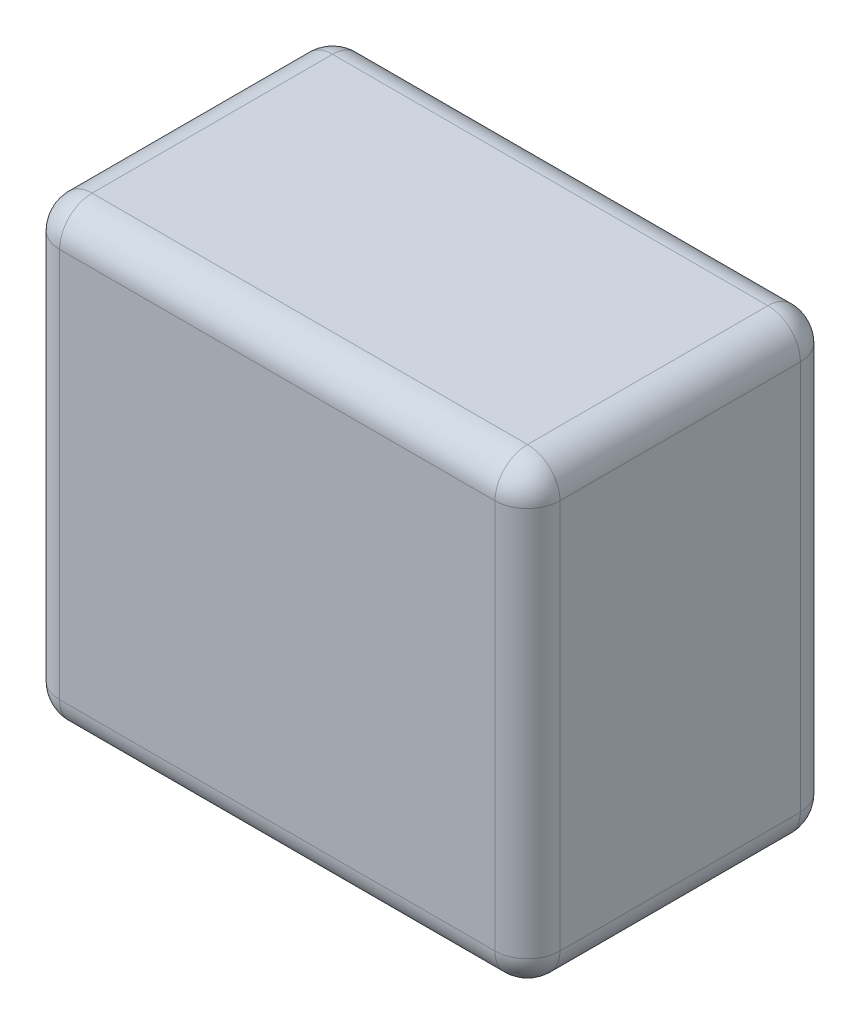
ISO-10303-21;
HEADER;
FILE_DESCRIPTION(('STEP AP214'),'2;1');
FILE_NAME('part.step','',(''),(''),'','','');
FILE_SCHEMA(('AUTOMOTIVE_DESIGN { 1 0 10303 214 1 1 1 1 }'));
ENDSEC;
DATA;
#1=APPLICATION_CONTEXT('core data for automotive mechanical design processes');
#2=APPLICATION_PROTOCOL_DEFINITION('international standard','automotive_design',2000,#1);
#3=PRODUCT_CONTEXT('',#1,'mechanical');
#4=PRODUCT('Part','Part','',(#3));
#5=PRODUCT_RELATED_PRODUCT_CATEGORY('part','',(#4));
#6=PRODUCT_DEFINITION_FORMATION('','',#4);
#7=PRODUCT_DEFINITION_CONTEXT('part definition',#1,'design');
#8=PRODUCT_DEFINITION('design','',#6,#7);
#9=PRODUCT_DEFINITION_SHAPE('','',#8);
#10=(LENGTH_UNIT() NAMED_UNIT(*) SI_UNIT(.MILLI.,.METRE.));
#11=(NAMED_UNIT(*) PLANE_ANGLE_UNIT() SI_UNIT($,.RADIAN.));
#12=(NAMED_UNIT(*) SI_UNIT($,.STERADIAN.) SOLID_ANGLE_UNIT());
#13=UNCERTAINTY_MEASURE_WITH_UNIT(LENGTH_MEASURE(1.E-05),#10,'distance_accuracy_value','');
#14=(GEOMETRIC_REPRESENTATION_CONTEXT(3) GLOBAL_UNCERTAINTY_ASSIGNED_CONTEXT((#13)) GLOBAL_UNIT_ASSIGNED_CONTEXT((#10,
#11,#12)) REPRESENTATION_CONTEXT('',''));
#15=CARTESIAN_POINT('',(0.,0.,0.));
#16=DIRECTION('',(0.,0.,1.));
#17=DIRECTION('',(1.,0.,0.));
#18=AXIS2_PLACEMENT_3D('',#15,#16,#17);
#19=CARTESIAN_POINT('',(0.,0.,47.));
#20=DIRECTION('',(1.,0.,0.));
#21=DIRECTION('',(0.,0.,-1.));
#22=AXIS2_PLACEMENT_3D('',#19,#20,#21);
#23=PLANE('',#22);
#24=DIRECTION('',(0.,0.,-1.));
#25=VECTOR('',#24,1.);
#26=CARTESIAN_POINT('',(0.,65.,47.));
#27=LINE('',#26,#25);
#28=CARTESIAN_POINT('',(0.,65.,42.));
#29=VERTEX_POINT('',#28);
#30=CARTESIAN_POINT('',(0.,65.,5.));
#31=VERTEX_POINT('',#30);
#32=EDGE_CURVE('E164',#29,#31,#27,.T.);
#33=ORIENTED_EDGE('',*,*,#32,.T.);
#34=DIRECTION('',(0.,-1.,0.));
#35=VECTOR('',#34,1.);
#36=CARTESIAN_POINT('',(0.,0.,5.));
#37=LINE('',#36,#35);
#38=CARTESIAN_POINT('',(0.,5.,5.));
#39=VERTEX_POINT('',#38);
#40=EDGE_CURVE('E134',#31,#39,#37,.T.);
#41=ORIENTED_EDGE('',*,*,#40,.T.);
#42=DIRECTION('',(0.,0.,-1.));
#43=VECTOR('',#42,1.);
#44=CARTESIAN_POINT('',(0.,5.,47.));
#45=LINE('',#44,#43);
#46=CARTESIAN_POINT('',(0.,5.,42.));
#47=VERTEX_POINT('',#46);
#48=EDGE_CURVE('E154',#39,#47,#45,.F.);
#49=ORIENTED_EDGE('',*,*,#48,.T.);
#50=DIRECTION('',(0.,-1.,0.));
#51=VECTOR('',#50,1.);
#52=CARTESIAN_POINT('',(0.,0.,42.));
#53=LINE('',#52,#51);
#54=EDGE_CURVE('E161',#47,#29,#53,.F.);
#55=ORIENTED_EDGE('',*,*,#54,.T.);
#56=EDGE_LOOP('',(#33,#41,#49,#55));
#57=FACE_BOUND('',#56,.T.);
#58=ADVANCED_FACE('F39',(#57),#23,.F.);
#59=CARTESIAN_POINT('',(0.,0.,47.));
#60=DIRECTION('',(0.,1.,0.));
#61=DIRECTION('',(0.,0.,1.));
#62=AXIS2_PLACEMENT_3D('',#59,#60,#61);
#63=PLANE('',#62);
#64=DIRECTION('',(1.,0.,0.));
#65=VECTOR('',#64,1.);
#66=CARTESIAN_POINT('',(0.,0.,42.));
#67=LINE('',#66,#65);
#68=CARTESIAN_POINT('',(72.,0.,42.));
#69=VERTEX_POINT('',#68);
#70=CARTESIAN_POINT('',(5.,0.,42.));
#71=VERTEX_POINT('',#70);
#72=EDGE_CURVE('E49',#69,#71,#67,.F.);
#73=ORIENTED_EDGE('',*,*,#72,.T.);
#74=DIRECTION('',(0.,0.,-1.));
#75=VECTOR('',#74,1.);
#76=CARTESIAN_POINT('',(5.,0.,47.));
#77=LINE('',#76,#75);
#78=CARTESIAN_POINT('',(5.,0.,5.));
#79=VERTEX_POINT('',#78);
#80=EDGE_CURVE('E11',#71,#79,#77,.T.);
#81=ORIENTED_EDGE('',*,*,#80,.T.);
#82=DIRECTION('',(1.,0.,0.));
#83=VECTOR('',#82,1.);
#84=CARTESIAN_POINT('',(77.,0.,5.));
#85=LINE('',#84,#83);
#86=CARTESIAN_POINT('',(72.,0.,5.));
#87=VERTEX_POINT('',#86);
#88=EDGE_CURVE('E222',#79,#87,#85,.T.);
#89=ORIENTED_EDGE('',*,*,#88,.T.);
#90=DIRECTION('',(0.,0.,-1.));
#91=VECTOR('',#90,1.);
#92=CARTESIAN_POINT('',(72.,0.,47.));
#93=LINE('',#92,#91);
#94=EDGE_CURVE('E60',#87,#69,#93,.F.);
#95=ORIENTED_EDGE('',*,*,#94,.T.);
#96=EDGE_LOOP('',(#73,#81,#89,#95));
#97=FACE_BOUND('',#96,.T.);
#98=ADVANCED_FACE('F384',(#97),#63,.F.);
#99=CARTESIAN_POINT('',(77.,0.,47.));
#100=DIRECTION('',(-1.,0.,0.));
#101=DIRECTION('',(0.,0.,1.));
#102=AXIS2_PLACEMENT_3D('',#99,#100,#101);
#103=PLANE('',#102);
#104=DIRECTION('',(0.,0.,-1.));
#105=VECTOR('',#104,1.);
#106=CARTESIAN_POINT('',(77.,65.,47.));
#107=LINE('',#106,#105);
#108=CARTESIAN_POINT('',(77.,65.,5.));
#109=VERTEX_POINT('',#108);
#110=CARTESIAN_POINT('',(77.,65.,42.));
#111=VERTEX_POINT('',#110);
#112=EDGE_CURVE('E215',#109,#111,#107,.F.);
#113=ORIENTED_EDGE('',*,*,#112,.T.);
#114=DIRECTION('',(0.,1.,0.));
#115=VECTOR('',#114,1.);
#116=CARTESIAN_POINT('',(77.,0.,42.));
#117=LINE('',#116,#115);
#118=CARTESIAN_POINT('',(77.,5.,42.));
#119=VERTEX_POINT('',#118);
#120=EDGE_CURVE('E218',#111,#119,#117,.F.);
#121=ORIENTED_EDGE('',*,*,#120,.T.);
#122=DIRECTION('',(0.,0.,-1.));
#123=VECTOR('',#122,1.);
#124=CARTESIAN_POINT('',(77.,5.,47.));
#125=LINE('',#124,#123);
#126=CARTESIAN_POINT('',(77.,5.,5.));
#127=VERTEX_POINT('',#126);
#128=EDGE_CURVE('E209',#119,#127,#125,.T.);
#129=ORIENTED_EDGE('',*,*,#128,.T.);
#130=DIRECTION('',(0.,1.,0.));
#131=VECTOR('',#130,1.);
#132=CARTESIAN_POINT('',(77.,70.,5.));
#133=LINE('',#132,#131);
#134=EDGE_CURVE('E212',#127,#109,#133,.T.);
#135=ORIENTED_EDGE('',*,*,#134,.T.);
#136=EDGE_LOOP('',(#113,#121,#129,#135));
#137=FACE_BOUND('',#136,.T.);
#138=ADVANCED_FACE('F336',(#137),#103,.F.);
#139=CARTESIAN_POINT('',(0.,70.,47.));
#140=DIRECTION('',(0.,-1.,0.));
#141=DIRECTION('',(0.,0.,-1.));
#142=AXIS2_PLACEMENT_3D('',#139,#140,#141);
#143=PLANE('',#142);
#144=DIRECTION('',(-1.,0.,0.));
#145=VECTOR('',#144,1.);
#146=CARTESIAN_POINT('',(0.,70.,5.));
#147=LINE('',#146,#145);
#148=CARTESIAN_POINT('',(72.,70.,5.));
#149=VERTEX_POINT('',#148);
#150=CARTESIAN_POINT('',(5.,70.,5.));
#151=VERTEX_POINT('',#150);
#152=EDGE_CURVE('E189',#149,#151,#147,.T.);
#153=ORIENTED_EDGE('',*,*,#152,.T.);
#154=DIRECTION('',(0.,0.,-1.));
#155=VECTOR('',#154,1.);
#156=CARTESIAN_POINT('',(5.,70.,47.));
#157=LINE('',#156,#155);
#158=CARTESIAN_POINT('',(5.,70.,42.));
#159=VERTEX_POINT('',#158);
#160=EDGE_CURVE('E192',#151,#159,#157,.F.);
#161=ORIENTED_EDGE('',*,*,#160,.T.);
#162=DIRECTION('',(-1.,0.,0.));
#163=VECTOR('',#162,1.);
#164=CARTESIAN_POINT('',(0.,70.,42.));
#165=LINE('',#164,#163);
#166=CARTESIAN_POINT('',(72.,70.,42.));
#167=VERTEX_POINT('',#166);
#168=EDGE_CURVE('E186',#159,#167,#165,.F.);
#169=ORIENTED_EDGE('',*,*,#168,.T.);
#170=DIRECTION('',(0.,0.,-1.));
#171=VECTOR('',#170,1.);
#172=CARTESIAN_POINT('',(72.,70.,47.));
#173=LINE('',#172,#171);
#174=EDGE_CURVE('E183',#167,#149,#173,.T.);
#175=ORIENTED_EDGE('',*,*,#174,.T.);
#176=EDGE_LOOP('',(#153,#161,#169,#175));
#177=FACE_BOUND('',#176,.T.);
#178=ADVANCED_FACE('F324',(#177),#143,.F.);
#179=CARTESIAN_POINT('',(0.,0.,47.));
#180=DIRECTION('',(0.,0.,-1.));
#181=DIRECTION('',(-1.,0.,0.));
#182=AXIS2_PLACEMENT_3D('',#179,#180,#181);
#183=PLANE('',#182);
#184=DIRECTION('',(0.,1.,0.));
#185=VECTOR('',#184,1.);
#186=CARTESIAN_POINT('',(72.,0.,47.));
#187=LINE('',#186,#185);
#188=CARTESIAN_POINT('',(72.,5.,47.));
#189=VERTEX_POINT('',#188);
#190=CARTESIAN_POINT('',(72.,65.,47.));
#191=VERTEX_POINT('',#190);
#192=EDGE_CURVE('E199',#189,#191,#187,.T.);
#193=ORIENTED_EDGE('',*,*,#192,.T.);
#194=DIRECTION('',(-1.,0.,0.));
#195=VECTOR('',#194,1.);
#196=CARTESIAN_POINT('',(0.,65.,47.));
#197=LINE('',#196,#195);
#198=CARTESIAN_POINT('',(5.,65.,47.));
#199=VERTEX_POINT('',#198);
#200=EDGE_CURVE('E205',#191,#199,#197,.T.);
#201=ORIENTED_EDGE('',*,*,#200,.T.);
#202=DIRECTION('',(0.,-1.,0.));
#203=VECTOR('',#202,1.);
#204=CARTESIAN_POINT('',(5.,0.,47.));
#205=LINE('',#204,#203);
#206=CARTESIAN_POINT('',(5.,5.,47.));
#207=VERTEX_POINT('',#206);
#208=EDGE_CURVE('E202',#199,#207,#205,.T.);
#209=ORIENTED_EDGE('',*,*,#208,.T.);
#210=DIRECTION('',(1.,0.,0.));
#211=VECTOR('',#210,1.);
#212=CARTESIAN_POINT('',(0.,5.,47.));
#213=LINE('',#212,#211);
#214=EDGE_CURVE('E196',#207,#189,#213,.T.);
#215=ORIENTED_EDGE('',*,*,#214,.T.);
#216=EDGE_LOOP('',(#193,#201,#209,#215));
#217=FACE_BOUND('',#216,.T.);
#218=ADVANCED_FACE('F333',(#217),#183,.F.);
#219=CARTESIAN_POINT('',(0.,0.,0.));
#220=DIRECTION('',(0.,0.,-1.));
#221=DIRECTION('',(-1.,0.,0.));
#222=AXIS2_PLACEMENT_3D('',#219,#220,#221);
#223=PLANE('',#222);
#224=DIRECTION('',(1.,0.,0.));
#225=VECTOR('',#224,1.);
#226=CARTESIAN_POINT('',(0.,5.,0.));
#227=LINE('',#226,#225);
#228=CARTESIAN_POINT('',(72.,5.,0.));
#229=VERTEX_POINT('',#228);
#230=CARTESIAN_POINT('',(5.,5.,0.));
#231=VERTEX_POINT('',#230);
#232=EDGE_CURVE('E167',#229,#231,#227,.F.);
#233=ORIENTED_EDGE('',*,*,#232,.T.);
#234=DIRECTION('',(0.,-1.,0.));
#235=VECTOR('',#234,1.);
#236=CARTESIAN_POINT('',(5.,70.,0.));
#237=LINE('',#236,#235);
#238=CARTESIAN_POINT('',(5.,65.,0.));
#239=VERTEX_POINT('',#238);
#240=EDGE_CURVE('E136',#231,#239,#237,.F.);
#241=ORIENTED_EDGE('',*,*,#240,.T.);
#242=DIRECTION('',(-1.,0.,0.));
#243=VECTOR('',#242,1.);
#244=CARTESIAN_POINT('',(77.,65.,0.));
#245=LINE('',#244,#243);
#246=CARTESIAN_POINT('',(72.,65.,0.));
#247=VERTEX_POINT('',#246);
#248=EDGE_CURVE('E178',#239,#247,#245,.F.);
#249=ORIENTED_EDGE('',*,*,#248,.T.);
#250=DIRECTION('',(0.,1.,0.));
#251=VECTOR('',#250,1.);
#252=CARTESIAN_POINT('',(72.,0.,0.));
#253=LINE('',#252,#251);
#254=EDGE_CURVE('E171',#247,#229,#253,.F.);
#255=ORIENTED_EDGE('',*,*,#254,.T.);
#256=EDGE_LOOP('',(#233,#241,#249,#255));
#257=FACE_BOUND('',#256,.T.);
#258=ADVANCED_FACE('F352',(#257),#223,.T.);
#259=CARTESIAN_POINT('',(72.,0.,42.));
#260=DIRECTION('',(0.,1.,0.));
#261=DIRECTION('',(0.,0.,1.));
#262=AXIS2_PLACEMENT_3D('',#259,#260,#261);
#263=CYLINDRICAL_SURFACE('',#262,5.);
#264=CARTESIAN_POINT('',(72.,65.,42.));
#265=DIRECTION('',(0.,1.,0.));
#266=DIRECTION('',(0.,0.,1.));
#267=AXIS2_PLACEMENT_3D('',#264,#265,#266);
#268=CIRCLE('',#267,5.);
#269=EDGE_CURVE('E43',#191,#111,#268,.T.);
#270=ORIENTED_EDGE('',*,*,#269,.F.);
#271=ORIENTED_EDGE('',*,*,#192,.F.);
#272=CARTESIAN_POINT('',(72.,5.,42.));
#273=DIRECTION('',(0.,-1.,0.));
#274=DIRECTION('',(0.,0.,-1.));
#275=AXIS2_PLACEMENT_3D('',#272,#273,#274);
#276=CIRCLE('',#275,5.);
#277=EDGE_CURVE('E298',#119,#189,#276,.T.);
#278=ORIENTED_EDGE('',*,*,#277,.F.);
#279=ORIENTED_EDGE('',*,*,#120,.F.);
#280=EDGE_LOOP('',(#270,#271,#278,#279));
#281=FACE_BOUND('',#280,.T.);
#282=ADVANCED_FACE('F41',(#281),#263,.T.);
#283=CARTESIAN_POINT('',(72.,65.,42.));
#284=DIRECTION('',(0.,0.,1.));
#285=DIRECTION('',(1.,0.,0.));
#286=AXIS2_PLACEMENT_3D('',#283,#284,#285);
#287=SPHERICAL_SURFACE('',#286,5.);
#288=CARTESIAN_POINT('',(72.,65.,42.));
#289=DIRECTION('',(1.,0.,0.));
#290=DIRECTION('',(0.,0.,-1.));
#291=AXIS2_PLACEMENT_3D('',#288,#289,#290);
#292=CIRCLE('',#291,5.);
#293=EDGE_CURVE('E291',#191,#167,#292,.F.);
#294=ORIENTED_EDGE('',*,*,#293,.F.);
#295=ORIENTED_EDGE('',*,*,#269,.T.);
#296=CARTESIAN_POINT('',(72.,65.,42.));
#297=DIRECTION('',(0.,0.,1.));
#298=DIRECTION('',(1.,0.,0.));
#299=AXIS2_PLACEMENT_3D('',#296,#297,#298);
#300=CIRCLE('',#299,5.);
#301=EDGE_CURVE('E295',#167,#111,#300,.F.);
#302=ORIENTED_EDGE('',*,*,#301,.F.);
#303=EDGE_LOOP('',(#294,#295,#302));
#304=FACE_BOUND('',#303,.T.);
#305=ADVANCED_FACE('F311',(#304),#287,.T.);
#306=CARTESIAN_POINT('',(72.,5.,42.));
#307=DIRECTION('',(0.,0.,1.));
#308=DIRECTION('',(1.,0.,0.));
#309=AXIS2_PLACEMENT_3D('',#306,#307,#308);
#310=SPHERICAL_SURFACE('',#309,5.);
#311=CARTESIAN_POINT('',(72.,5.,42.));
#312=DIRECTION('',(0.,0.,1.));
#313=DIRECTION('',(1.,0.,0.));
#314=AXIS2_PLACEMENT_3D('',#311,#312,#313);
#315=CIRCLE('',#314,5.);
#316=EDGE_CURVE('E284',#119,#69,#315,.F.);
#317=ORIENTED_EDGE('',*,*,#316,.F.);
#318=ORIENTED_EDGE('',*,*,#277,.T.);
#319=CARTESIAN_POINT('',(72.,5.,42.));
#320=DIRECTION('',(1.,0.,0.));
#321=DIRECTION('',(0.,0.,-1.));
#322=AXIS2_PLACEMENT_3D('',#319,#320,#321);
#323=CIRCLE('',#322,5.);
#324=EDGE_CURVE('E287',#69,#189,#323,.F.);
#325=ORIENTED_EDGE('',*,*,#324,.F.);
#326=EDGE_LOOP('',(#317,#318,#325));
#327=FACE_BOUND('',#326,.T.);
#328=ADVANCED_FACE('F375',(#327),#310,.T.);
#329=CARTESIAN_POINT('',(72.,65.,47.));
#330=DIRECTION('',(0.,0.,-1.));
#331=DIRECTION('',(-1.,0.,0.));
#332=AXIS2_PLACEMENT_3D('',#329,#330,#331);
#333=CYLINDRICAL_SURFACE('',#332,5.);
#334=ORIENTED_EDGE('',*,*,#301,.T.);
#335=ORIENTED_EDGE('',*,*,#112,.F.);
#336=CARTESIAN_POINT('',(72.,65.,5.));
#337=DIRECTION('',(0.,0.,-1.));
#338=DIRECTION('',(-1.,0.,0.));
#339=AXIS2_PLACEMENT_3D('',#336,#337,#338);
#340=CIRCLE('',#339,5.);
#341=EDGE_CURVE('E276',#149,#109,#340,.T.);
#342=ORIENTED_EDGE('',*,*,#341,.F.);
#343=ORIENTED_EDGE('',*,*,#174,.F.);
#344=EDGE_LOOP('',(#334,#335,#342,#343));
#345=FACE_BOUND('',#344,.T.);
#346=ADVANCED_FACE('F319',(#345),#333,.T.);
#347=CARTESIAN_POINT('',(0.,65.,42.));
#348=DIRECTION('',(-1.,0.,0.));
#349=DIRECTION('',(0.,0.,1.));
#350=AXIS2_PLACEMENT_3D('',#347,#348,#349);
#351=CYLINDRICAL_SURFACE('',#350,5.);
#352=ORIENTED_EDGE('',*,*,#293,.T.);
#353=ORIENTED_EDGE('',*,*,#168,.F.);
#354=CARTESIAN_POINT('',(5.,65.,42.));
#355=DIRECTION('',(-1.,0.,0.));
#356=DIRECTION('',(0.,0.,1.));
#357=AXIS2_PLACEMENT_3D('',#354,#355,#356);
#358=CIRCLE('',#357,5.);
#359=EDGE_CURVE('E272',#199,#159,#358,.T.);
#360=ORIENTED_EDGE('',*,*,#359,.F.);
#361=ORIENTED_EDGE('',*,*,#200,.F.);
#362=EDGE_LOOP('',(#352,#353,#360,#361));
#363=FACE_BOUND('',#362,.T.);
#364=ADVANCED_FACE('F330',(#363),#351,.T.);
#365=CARTESIAN_POINT('',(5.,0.,42.));
#366=DIRECTION('',(0.,-1.,0.));
#367=DIRECTION('',(0.,0.,-1.));
#368=AXIS2_PLACEMENT_3D('',#365,#366,#367);
#369=CYLINDRICAL_SURFACE('',#368,5.);
#370=CARTESIAN_POINT('',(5.,5.,42.));
#371=DIRECTION('',(0.,-1.,0.));
#372=DIRECTION('',(0.,0.,-1.));
#373=AXIS2_PLACEMENT_3D('',#370,#371,#372);
#374=CIRCLE('',#373,5.);
#375=EDGE_CURVE('E265',#207,#47,#374,.T.);
#376=ORIENTED_EDGE('',*,*,#375,.F.);
#377=ORIENTED_EDGE('',*,*,#208,.F.);
#378=CARTESIAN_POINT('',(5.,65.,42.));
#379=DIRECTION('',(0.,1.,0.));
#380=DIRECTION('',(0.,0.,1.));
#381=AXIS2_PLACEMENT_3D('',#378,#379,#380);
#382=CIRCLE('',#381,5.);
#383=EDGE_CURVE('E269',#29,#199,#382,.T.);
#384=ORIENTED_EDGE('',*,*,#383,.F.);
#385=ORIENTED_EDGE('',*,*,#54,.F.);
#386=EDGE_LOOP('',(#376,#377,#384,#385));
#387=FACE_BOUND('',#386,.T.);
#388=ADVANCED_FACE('F370',(#387),#369,.T.);
#389=CARTESIAN_POINT('',(0.,5.,42.));
#390=DIRECTION('',(1.,0.,0.));
#391=DIRECTION('',(0.,0.,-1.));
#392=AXIS2_PLACEMENT_3D('',#389,#390,#391);
#393=CYLINDRICAL_SURFACE('',#392,5.);
#394=ORIENTED_EDGE('',*,*,#324,.T.);
#395=ORIENTED_EDGE('',*,*,#214,.F.);
#396=CARTESIAN_POINT('',(5.,5.,42.));
#397=DIRECTION('',(-1.,0.,0.));
#398=DIRECTION('',(0.,0.,1.));
#399=AXIS2_PLACEMENT_3D('',#396,#397,#398);
#400=CIRCLE('',#399,5.);
#401=EDGE_CURVE('E261',#71,#207,#400,.T.);
#402=ORIENTED_EDGE('',*,*,#401,.F.);
#403=ORIENTED_EDGE('',*,*,#72,.F.);
#404=EDGE_LOOP('',(#394,#395,#402,#403));
#405=FACE_BOUND('',#404,.T.);
#406=ADVANCED_FACE('F374',(#405),#393,.T.);
#407=CARTESIAN_POINT('',(72.,5.,47.));
#408=DIRECTION('',(0.,0.,-1.));
#409=DIRECTION('',(-1.,0.,0.));
#410=AXIS2_PLACEMENT_3D('',#407,#408,#409);
#411=CYLINDRICAL_SURFACE('',#410,5.);
#412=ORIENTED_EDGE('',*,*,#316,.T.);
#413=ORIENTED_EDGE('',*,*,#94,.F.);
#414=CARTESIAN_POINT('',(72.,5.,5.));
#415=DIRECTION('',(0.,0.,-1.));
#416=DIRECTION('',(-1.,0.,0.));
#417=AXIS2_PLACEMENT_3D('',#414,#415,#416);
#418=CIRCLE('',#417,5.);
#419=EDGE_CURVE('E257',#127,#87,#418,.T.);
#420=ORIENTED_EDGE('',*,*,#419,.F.);
#421=ORIENTED_EDGE('',*,*,#128,.F.);
#422=EDGE_LOOP('',(#412,#413,#420,#421));
#423=FACE_BOUND('',#422,.T.);
#424=ADVANCED_FACE('F345',(#423),#411,.T.);
#425=CARTESIAN_POINT('',(72.,0.,5.));
#426=DIRECTION('',(0.,-1.,0.));
#427=DIRECTION('',(0.,0.,-1.));
#428=AXIS2_PLACEMENT_3D('',#425,#426,#427);
#429=CYLINDRICAL_SURFACE('',#428,5.);
#430=CARTESIAN_POINT('',(72.,65.,5.));
#431=DIRECTION('',(0.,1.,0.));
#432=DIRECTION('',(0.,0.,1.));
#433=AXIS2_PLACEMENT_3D('',#430,#431,#432);
#434=CIRCLE('',#433,5.);
#435=EDGE_CURVE('E280',#109,#247,#434,.T.);
#436=ORIENTED_EDGE('',*,*,#435,.F.);
#437=ORIENTED_EDGE('',*,*,#134,.F.);
#438=CARTESIAN_POINT('',(72.,5.,5.));
#439=DIRECTION('',(0.,-1.,0.));
#440=DIRECTION('',(0.,0.,-1.));
#441=AXIS2_PLACEMENT_3D('',#438,#439,#440);
#442=CIRCLE('',#441,5.);
#443=EDGE_CURVE('E253',#229,#127,#442,.T.);
#444=ORIENTED_EDGE('',*,*,#443,.F.);
#445=ORIENTED_EDGE('',*,*,#254,.F.);
#446=EDGE_LOOP('',(#436,#437,#444,#445));
#447=FACE_BOUND('',#446,.T.);
#448=ADVANCED_FACE('F341',(#447),#429,.T.);
#449=CARTESIAN_POINT('',(72.,65.,5.));
#450=DIRECTION('',(0.,0.,1.));
#451=DIRECTION('',(1.,0.,0.));
#452=AXIS2_PLACEMENT_3D('',#449,#450,#451);
#453=SPHERICAL_SURFACE('',#452,5.);
#454=ORIENTED_EDGE('',*,*,#341,.T.);
#455=ORIENTED_EDGE('',*,*,#435,.T.);
#456=CARTESIAN_POINT('',(72.,65.,5.));
#457=DIRECTION('',(1.,0.,0.));
#458=DIRECTION('',(0.,0.,-1.));
#459=AXIS2_PLACEMENT_3D('',#456,#457,#458);
#460=CIRCLE('',#459,5.);
#461=EDGE_CURVE('E249',#149,#247,#460,.F.);
#462=ORIENTED_EDGE('',*,*,#461,.F.);
#463=EDGE_LOOP('',(#454,#455,#462));
#464=FACE_BOUND('',#463,.T.);
#465=ADVANCED_FACE('F355',(#464),#453,.T.);
#466=CARTESIAN_POINT('',(5.,65.,42.));
#467=DIRECTION('',(0.,0.,1.));
#468=DIRECTION('',(1.,0.,0.));
#469=AXIS2_PLACEMENT_3D('',#466,#467,#468);
#470=SPHERICAL_SURFACE('',#469,5.);
#471=ORIENTED_EDGE('',*,*,#383,.T.);
#472=ORIENTED_EDGE('',*,*,#359,.T.);
#473=CARTESIAN_POINT('',(5.,65.,42.));
#474=DIRECTION('',(0.,0.,1.));
#475=DIRECTION('',(1.,0.,0.));
#476=AXIS2_PLACEMENT_3D('',#473,#474,#475);
#477=CIRCLE('',#476,5.);
#478=EDGE_CURVE('E246',#29,#159,#477,.F.);
#479=ORIENTED_EDGE('',*,*,#478,.F.);
#480=EDGE_LOOP('',(#471,#472,#479));
#481=FACE_BOUND('',#480,.T.);
#482=ADVANCED_FACE('F366',(#481),#470,.T.);
#483=CARTESIAN_POINT('',(5.,5.,42.));
#484=DIRECTION('',(0.,0.,1.));
#485=DIRECTION('',(1.,0.,0.));
#486=AXIS2_PLACEMENT_3D('',#483,#484,#485);
#487=SPHERICAL_SURFACE('',#486,5.);
#488=ORIENTED_EDGE('',*,*,#401,.T.);
#489=ORIENTED_EDGE('',*,*,#375,.T.);
#490=CARTESIAN_POINT('',(5.,5.,42.));
#491=DIRECTION('',(0.,0.,1.));
#492=DIRECTION('',(1.,0.,0.));
#493=AXIS2_PLACEMENT_3D('',#490,#491,#492);
#494=CIRCLE('',#493,5.);
#495=EDGE_CURVE('E157',#71,#47,#494,.F.);
#496=ORIENTED_EDGE('',*,*,#495,.F.);
#497=EDGE_LOOP('',(#488,#489,#496));
#498=FACE_BOUND('',#497,.T.);
#499=ADVANCED_FACE('F372',(#498),#487,.T.);
#500=CARTESIAN_POINT('',(72.,5.,5.));
#501=DIRECTION('',(0.,0.,1.));
#502=DIRECTION('',(1.,0.,0.));
#503=AXIS2_PLACEMENT_3D('',#500,#501,#502);
#504=SPHERICAL_SURFACE('',#503,5.);
#505=ORIENTED_EDGE('',*,*,#443,.T.);
#506=ORIENTED_EDGE('',*,*,#419,.T.);
#507=CARTESIAN_POINT('',(72.,5.,5.));
#508=DIRECTION('',(1.,0.,0.));
#509=DIRECTION('',(0.,0.,-1.));
#510=AXIS2_PLACEMENT_3D('',#507,#508,#509);
#511=CIRCLE('',#510,5.);
#512=EDGE_CURVE('E240',#229,#87,#511,.F.);
#513=ORIENTED_EDGE('',*,*,#512,.F.);
#514=EDGE_LOOP('',(#505,#506,#513));
#515=FACE_BOUND('',#514,.T.);
#516=ADVANCED_FACE('F347',(#515),#504,.T.);
#517=CARTESIAN_POINT('',(0.,65.,5.));
#518=DIRECTION('',(1.,0.,0.));
#519=DIRECTION('',(0.,0.,-1.));
#520=AXIS2_PLACEMENT_3D('',#517,#518,#519);
#521=CYLINDRICAL_SURFACE('',#520,5.);
#522=ORIENTED_EDGE('',*,*,#461,.T.);
#523=ORIENTED_EDGE('',*,*,#248,.F.);
#524=CARTESIAN_POINT('',(5.,65.,5.));
#525=DIRECTION('',(-1.,0.,0.));
#526=DIRECTION('',(0.,0.,1.));
#527=AXIS2_PLACEMENT_3D('',#524,#525,#526);
#528=CIRCLE('',#527,5.);
#529=EDGE_CURVE('E236',#151,#239,#528,.T.);
#530=ORIENTED_EDGE('',*,*,#529,.F.);
#531=ORIENTED_EDGE('',*,*,#152,.F.);
#532=EDGE_LOOP('',(#522,#523,#530,#531));
#533=FACE_BOUND('',#532,.T.);
#534=ADVANCED_FACE('F357',(#533),#521,.T.);
#535=CARTESIAN_POINT('',(5.,65.,47.));
#536=DIRECTION('',(0.,0.,-1.));
#537=DIRECTION('',(-1.,0.,0.));
#538=AXIS2_PLACEMENT_3D('',#535,#536,#537);
#539=CYLINDRICAL_SURFACE('',#538,5.);
#540=ORIENTED_EDGE('',*,*,#478,.T.);
#541=ORIENTED_EDGE('',*,*,#160,.F.);
#542=CARTESIAN_POINT('',(5.,65.,5.));
#543=DIRECTION('',(0.,0.,-1.));
#544=DIRECTION('',(-1.,0.,0.));
#545=AXIS2_PLACEMENT_3D('',#542,#543,#544);
#546=CIRCLE('',#545,5.);
#547=EDGE_CURVE('E151',#31,#151,#546,.T.);
#548=ORIENTED_EDGE('',*,*,#547,.F.);
#549=ORIENTED_EDGE('',*,*,#32,.F.);
#550=EDGE_LOOP('',(#540,#541,#548,#549));
#551=FACE_BOUND('',#550,.T.);
#552=ADVANCED_FACE('F363',(#551),#539,.T.);
#553=CARTESIAN_POINT('',(5.,5.,47.));
#554=DIRECTION('',(0.,0.,-1.));
#555=DIRECTION('',(-1.,0.,0.));
#556=AXIS2_PLACEMENT_3D('',#553,#554,#555);
#557=CYLINDRICAL_SURFACE('',#556,5.);
#558=ORIENTED_EDGE('',*,*,#495,.T.);
#559=ORIENTED_EDGE('',*,*,#48,.F.);
#560=CARTESIAN_POINT('',(5.,5.,5.));
#561=DIRECTION('',(0.,0.,-1.));
#562=DIRECTION('',(-1.,0.,0.));
#563=AXIS2_PLACEMENT_3D('',#560,#561,#562);
#564=CIRCLE('',#563,5.);
#565=EDGE_CURVE('E142',#79,#39,#564,.T.);
#566=ORIENTED_EDGE('',*,*,#565,.F.);
#567=ORIENTED_EDGE('',*,*,#80,.F.);
#568=EDGE_LOOP('',(#558,#559,#566,#567));
#569=FACE_BOUND('',#568,.T.);
#570=ADVANCED_FACE('F155',(#569),#557,.T.);
#571=CARTESIAN_POINT('',(0.,5.,5.));
#572=DIRECTION('',(-1.,0.,0.));
#573=DIRECTION('',(0.,0.,1.));
#574=AXIS2_PLACEMENT_3D('',#571,#572,#573);
#575=CYLINDRICAL_SURFACE('',#574,5.);
#576=ORIENTED_EDGE('',*,*,#512,.T.);
#577=ORIENTED_EDGE('',*,*,#88,.F.);
#578=CARTESIAN_POINT('',(5.,5.,5.));
#579=DIRECTION('',(-1.,0.,0.));
#580=DIRECTION('',(0.,0.,1.));
#581=AXIS2_PLACEMENT_3D('',#578,#579,#580);
#582=CIRCLE('',#581,5.);
#583=EDGE_CURVE('E146',#231,#79,#582,.T.);
#584=ORIENTED_EDGE('',*,*,#583,.F.);
#585=ORIENTED_EDGE('',*,*,#232,.F.);
#586=EDGE_LOOP('',(#576,#577,#584,#585));
#587=FACE_BOUND('',#586,.T.);
#588=ADVANCED_FACE('F350',(#587),#575,.T.);
#589=CARTESIAN_POINT('',(5.,65.,5.));
#590=DIRECTION('',(0.,0.,1.));
#591=DIRECTION('',(1.,0.,0.));
#592=AXIS2_PLACEMENT_3D('',#589,#590,#591);
#593=SPHERICAL_SURFACE('',#592,5.);
#594=ORIENTED_EDGE('',*,*,#547,.T.);
#595=ORIENTED_EDGE('',*,*,#529,.T.);
#596=CARTESIAN_POINT('',(5.,65.,5.));
#597=DIRECTION('',(0.,1.,0.));
#598=DIRECTION('',(0.,0.,1.));
#599=AXIS2_PLACEMENT_3D('',#596,#597,#598);
#600=CIRCLE('',#599,5.);
#601=EDGE_CURVE('E139',#31,#239,#600,.F.);
#602=ORIENTED_EDGE('',*,*,#601,.F.);
#603=EDGE_LOOP('',(#594,#595,#602));
#604=FACE_BOUND('',#603,.T.);
#605=ADVANCED_FACE('F361',(#604),#593,.T.);
#606=CARTESIAN_POINT('',(5.,5.,5.));
#607=DIRECTION('',(0.,0.,1.));
#608=DIRECTION('',(1.,0.,0.));
#609=AXIS2_PLACEMENT_3D('',#606,#607,#608);
#610=SPHERICAL_SURFACE('',#609,5.);
#611=ORIENTED_EDGE('',*,*,#583,.T.);
#612=ORIENTED_EDGE('',*,*,#565,.T.);
#613=CARTESIAN_POINT('',(5.,5.,5.));
#614=DIRECTION('',(0.,-1.,0.));
#615=DIRECTION('',(0.,0.,-1.));
#616=AXIS2_PLACEMENT_3D('',#613,#614,#615);
#617=CIRCLE('',#616,5.);
#618=EDGE_CURVE('E130',#231,#39,#617,.F.);
#619=ORIENTED_EDGE('',*,*,#618,.F.);
#620=EDGE_LOOP('',(#611,#612,#619));
#621=FACE_BOUND('',#620,.T.);
#622=ADVANCED_FACE('F144',(#621),#610,.T.);
#623=CARTESIAN_POINT('',(5.,0.,5.));
#624=DIRECTION('',(0.,1.,0.));
#625=DIRECTION('',(0.,0.,1.));
#626=AXIS2_PLACEMENT_3D('',#623,#624,#625);
#627=CYLINDRICAL_SURFACE('',#626,5.);
#628=ORIENTED_EDGE('',*,*,#601,.T.);
#629=ORIENTED_EDGE('',*,*,#240,.F.);
#630=ORIENTED_EDGE('',*,*,#618,.T.);
#631=ORIENTED_EDGE('',*,*,#40,.F.);
#632=EDGE_LOOP('',(#628,#629,#630,#631));
#633=FACE_BOUND('',#632,.T.);
#634=ADVANCED_FACE('F132',(#633),#627,.T.);
#635=CLOSED_SHELL('',(#58,#98,#138,#178,#218,#258,#282,#305,#328,#346,#364,#388,#406,#424,#448,
#465,#482,#499,#516,#534,#552,#570,#588,#605,#622,#634));
#636=MANIFOLD_SOLID_BREP('B2',#635);
#637=ADVANCED_BREP_SHAPE_REPRESENTATION('',(#18,#636),#14);
#638=SHAPE_DEFINITION_REPRESENTATION(#9,#637);
ENDSEC;
END-ISO-10303-21;
